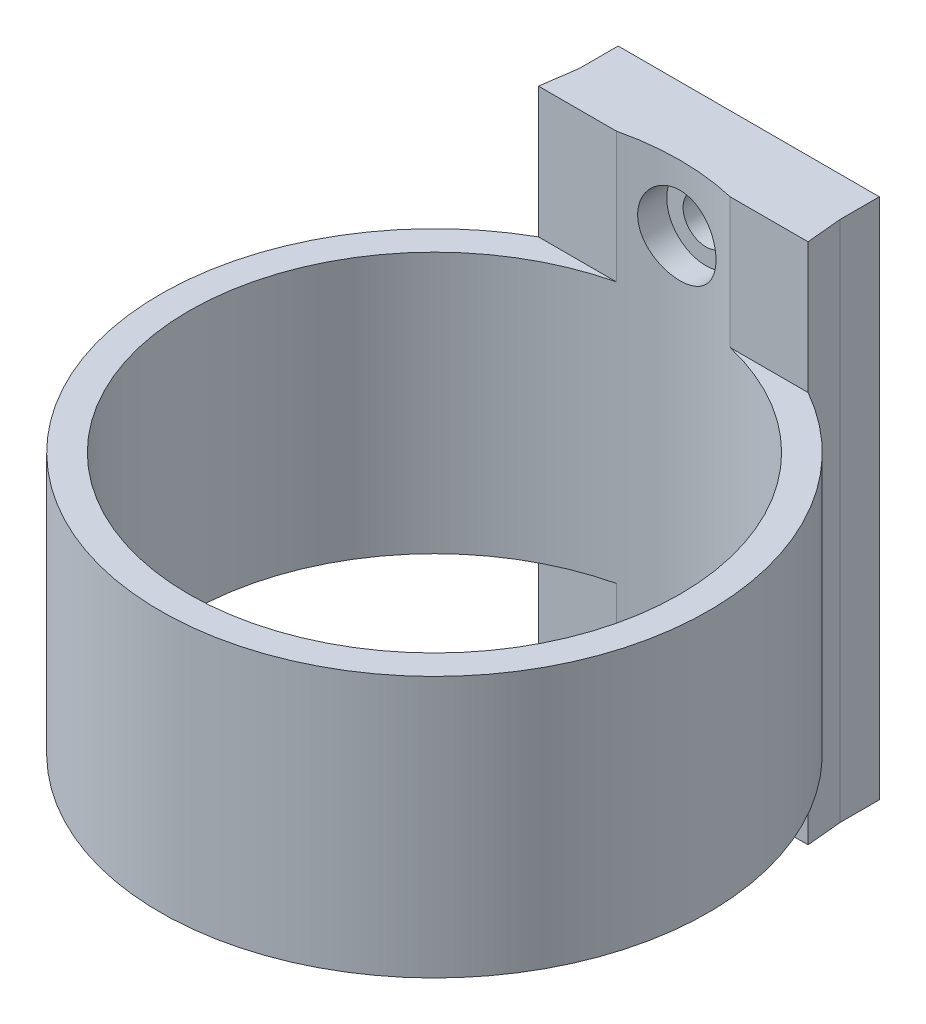
ISO-10303-21;
HEADER;
FILE_DESCRIPTION(('STEP AP214'),'2;1');
FILE_NAME('part.step','',(''),(''),'','','');
FILE_SCHEMA(('AUTOMOTIVE_DESIGN { 1 0 10303 214 1 1 1 1 }'));
ENDSEC;
DATA;
#1=APPLICATION_CONTEXT('core data for automotive mechanical design processes');
#2=APPLICATION_PROTOCOL_DEFINITION('international standard','automotive_design',2000,#1);
#3=PRODUCT_CONTEXT('',#1,'mechanical');
#4=PRODUCT('Part','Part','',(#3));
#5=PRODUCT_RELATED_PRODUCT_CATEGORY('part','',(#4));
#6=PRODUCT_DEFINITION_FORMATION('','',#4);
#7=PRODUCT_DEFINITION_CONTEXT('part definition',#1,'design');
#8=PRODUCT_DEFINITION('design','',#6,#7);
#9=PRODUCT_DEFINITION_SHAPE('','',#8);
#10=(LENGTH_UNIT() NAMED_UNIT(*) SI_UNIT(.MILLI.,.METRE.));
#11=(NAMED_UNIT(*) PLANE_ANGLE_UNIT() SI_UNIT($,.RADIAN.));
#12=(NAMED_UNIT(*) SI_UNIT($,.STERADIAN.) SOLID_ANGLE_UNIT());
#13=UNCERTAINTY_MEASURE_WITH_UNIT(LENGTH_MEASURE(1.E-05),#10,'distance_accuracy_value','');
#14=(GEOMETRIC_REPRESENTATION_CONTEXT(3) GLOBAL_UNCERTAINTY_ASSIGNED_CONTEXT((#13)) GLOBAL_UNIT_ASSIGNED_CONTEXT((#10,
#11,#12)) REPRESENTATION_CONTEXT('',''));
#15=CARTESIAN_POINT('',(0.,0.,0.));
#16=DIRECTION('',(0.,0.,1.));
#17=DIRECTION('',(1.,0.,0.));
#18=AXIS2_PLACEMENT_3D('',#15,#16,#17);
#19=CARTESIAN_POINT('',(0.,-30.8228188796824,-18.2877454768375));
#20=DIRECTION('',(0.,0.,1.));
#21=DIRECTION('',(1.,0.,0.));
#22=AXIS2_PLACEMENT_3D('',#19,#20,#21);
#23=PLANE('',#22);
#24=DIRECTION('',(0.,1.,0.));
#25=VECTOR('',#24,1.);
#26=CARTESIAN_POINT('',(4.35871143509305,-10.,-18.2877454768375));
#27=LINE('',#26,#25);
#28=CARTESIAN_POINT('',(4.35871143509305,-10.,-18.2877454768375));
#29=VERTEX_POINT('',#28);
#30=CARTESIAN_POINT('',(4.35871143509305,0.,-18.2877454768375));
#31=VERTEX_POINT('',#30);
#32=EDGE_CURVE('E141',#29,#31,#27,.T.);
#33=ORIENTED_EDGE('',*,*,#32,.F.);
#34=DIRECTION('',(-1.,0.,0.));
#35=VECTOR('',#34,1.);
#36=CARTESIAN_POINT('',(0.,-10.,-18.2877454768375));
#37=LINE('',#36,#35);
#38=CARTESIAN_POINT('',(10.3227111445788,-10.,-18.2877454768375));
#39=VERTEX_POINT('',#38);
#40=EDGE_CURVE('E147',#39,#29,#37,.T.);
#41=ORIENTED_EDGE('',*,*,#40,.F.);
#42=DIRECTION('',(0.,1.,0.));
#43=VECTOR('',#42,1.);
#44=CARTESIAN_POINT('',(10.3227111445788,-30.8228188796824,-18.2877454768375));
#45=LINE('',#44,#43);
#46=CARTESIAN_POINT('',(10.3227111445788,0.,-18.2877454768375));
#47=VERTEX_POINT('',#46);
#48=EDGE_CURVE('E73',#39,#47,#45,.T.);
#49=ORIENTED_EDGE('',*,*,#48,.T.);
#50=DIRECTION('',(1.,0.,0.));
#51=VECTOR('',#50,1.);
#52=CARTESIAN_POINT('',(0.,0.,-18.2877454768375));
#53=LINE('',#52,#51);
#54=EDGE_CURVE('E57',#31,#47,#53,.T.);
#55=ORIENTED_EDGE('',*,*,#54,.F.);
#56=EDGE_LOOP('',(#33,#41,#49,#55));
#57=FACE_BOUND('',#56,.T.);
#58=ADVANCED_FACE('F43',(#57),#23,.T.);
#59=CARTESIAN_POINT('',(4.35871143509305,20.,-18.2877454768375));
#60=VERTEX_POINT('',#59);
#61=CARTESIAN_POINT('',(4.35871143509305,30.,-18.2877454768375));
#62=VERTEX_POINT('',#61);
#63=EDGE_CURVE('E151',#60,#62,#27,.T.);
#64=ORIENTED_EDGE('',*,*,#63,.F.);
#65=DIRECTION('',(1.,0.,0.));
#66=VECTOR('',#65,1.);
#67=CARTESIAN_POINT('',(0.,20.,-18.2877454768375));
#68=LINE('',#67,#66);
#69=CARTESIAN_POINT('',(10.3227111445788,20.,-18.2877454768375));
#70=VERTEX_POINT('',#69);
#71=EDGE_CURVE('E156',#60,#70,#68,.T.);
#72=ORIENTED_EDGE('',*,*,#71,.T.);
#73=CARTESIAN_POINT('',(10.3227111445788,30.,-18.2877454768375));
#74=VERTEX_POINT('',#73);
#75=EDGE_CURVE('E236',#70,#74,#45,.T.);
#76=ORIENTED_EDGE('',*,*,#75,.T.);
#77=DIRECTION('',(1.,0.,0.));
#78=VECTOR('',#77,1.);
#79=CARTESIAN_POINT('',(0.,30.,-18.2877454768375));
#80=LINE('',#79,#78);
#81=EDGE_CURVE('E223',#62,#74,#80,.T.);
#82=ORIENTED_EDGE('',*,*,#81,.F.);
#83=EDGE_LOOP('',(#64,#72,#76,#82));
#84=FACE_BOUND('',#83,.T.);
#85=ADVANCED_FACE('F311',(#84),#23,.T.);
#86=DIRECTION('',(0.,1.,0.));
#87=VECTOR('',#86,1.);
#88=CARTESIAN_POINT('',(-4.35871143509305,-10.,-18.2877454768375));
#89=LINE('',#88,#87);
#90=CARTESIAN_POINT('',(-4.35871143509305,30.,-18.2877454768375));
#91=VERTEX_POINT('',#90);
#92=CARTESIAN_POINT('',(-4.35871143509305,20.,-18.2877454768375));
#93=VERTEX_POINT('',#92);
#94=EDGE_CURVE('E257',#91,#93,#89,.F.);
#95=ORIENTED_EDGE('',*,*,#94,.F.);
#96=CARTESIAN_POINT('',(-10.3227111445788,30.,-18.2877454768375));
#97=VERTEX_POINT('',#96);
#98=EDGE_CURVE('E224',#97,#91,#80,.T.);
#99=ORIENTED_EDGE('',*,*,#98,.F.);
#100=DIRECTION('',(0.,1.,0.));
#101=VECTOR('',#100,1.);
#102=CARTESIAN_POINT('',(-10.3227111445788,-30.8228188796824,-18.2877454768375));
#103=LINE('',#102,#101);
#104=CARTESIAN_POINT('',(-10.3227111445788,20.,-18.2877454768375));
#105=VERTEX_POINT('',#104);
#106=EDGE_CURVE('E230',#105,#97,#103,.T.);
#107=ORIENTED_EDGE('',*,*,#106,.F.);
#108=EDGE_CURVE('E159',#105,#93,#68,.T.);
#109=ORIENTED_EDGE('',*,*,#108,.T.);
#110=EDGE_LOOP('',(#95,#99,#107,#109));
#111=FACE_BOUND('',#110,.T.);
#112=ADVANCED_FACE('F256',(#111),#23,.T.);
#113=CARTESIAN_POINT('',(0.,25.,-24.));
#114=DIRECTION('',(0.,0.,1.));
#115=DIRECTION('',(1.,0.,0.));
#116=AXIS2_PLACEMENT_3D('',#113,#114,#115);
#117=CYLINDRICAL_SURFACE('',#116,1.75);
#118=CARTESIAN_POINT('',(0.,25.,-24.));
#119=DIRECTION('',(0.,0.,-1.));
#120=DIRECTION('',(-1.,0.,0.));
#121=AXIS2_PLACEMENT_3D('',#118,#119,#120);
#122=CIRCLE('',#121,1.75);
#123=CARTESIAN_POINT('',(-1.75,25.,-24.));
#124=VERTEX_POINT('',#123);
#125=EDGE_CURVE('E182',#124,#124,#122,.T.);
#126=ORIENTED_EDGE('',*,*,#125,.T.);
#127=EDGE_LOOP('',(#126));
#128=FACE_BOUND('',#127,.T.);
#129=CARTESIAN_POINT('',(0.,25.,-20.7877454768375));
#130=DIRECTION('',(0.,0.,1.));
#131=DIRECTION('',(1.,0.,0.));
#132=AXIS2_PLACEMENT_3D('',#129,#130,#131);
#133=CIRCLE('',#132,1.75);
#134=CARTESIAN_POINT('',(1.75,25.,-20.7877454768375));
#135=VERTEX_POINT('',#134);
#136=EDGE_CURVE('E179',#135,#135,#133,.T.);
#137=ORIENTED_EDGE('',*,*,#136,.T.);
#138=EDGE_LOOP('',(#137));
#139=FACE_BOUND('',#138,.T.);
#140=ADVANCED_FACE('F329',(#128,#139),#117,.F.);
#141=CARTESIAN_POINT('',(0.,20.,0.));
#142=DIRECTION('',(0.,-1.,0.));
#143=DIRECTION('',(0.,0.,-1.));
#144=AXIS2_PLACEMENT_3D('',#141,#142,#143);
#145=CYLINDRICAL_SURFACE('',#144,18.8);
#146=CARTESIAN_POINT('',(0.,20.,0.));
#147=DIRECTION('',(0.,1.,0.));
#148=DIRECTION('',(0.,0.,1.));
#149=AXIS2_PLACEMENT_3D('',#146,#147,#148);
#150=CIRCLE('',#149,18.8);
#151=EDGE_CURVE('E166',#93,#60,#150,.T.);
#152=ORIENTED_EDGE('',*,*,#151,.T.);
#153=ORIENTED_EDGE('',*,*,#63,.T.);
#154=CARTESIAN_POINT('',(0.,30.,0.));
#155=DIRECTION('',(0.,1.,0.));
#156=DIRECTION('',(0.,0.,1.));
#157=AXIS2_PLACEMENT_3D('',#154,#155,#156);
#158=CIRCLE('',#157,18.8);
#159=EDGE_CURVE('E145',#62,#91,#158,.T.);
#160=ORIENTED_EDGE('',*,*,#159,.T.);
#161=ORIENTED_EDGE('',*,*,#94,.T.);
#162=EDGE_LOOP('',(#152,#153,#160,#161));
#163=FACE_BOUND('',#162,.T.);
#164=CARTESIAN_POINT('',(0.,0.,0.));
#165=DIRECTION('',(0.,1.,0.));
#166=DIRECTION('',(0.,0.,1.));
#167=AXIS2_PLACEMENT_3D('',#164,#165,#166);
#168=CIRCLE('',#167,18.8);
#169=CARTESIAN_POINT('',(-4.35871143509305,0.,-18.2877454768375));
#170=VERTEX_POINT('',#169);
#171=EDGE_CURVE('E173',#170,#31,#168,.T.);
#172=ORIENTED_EDGE('',*,*,#171,.F.);
#173=CARTESIAN_POINT('',(-4.35871143509305,-10.,-18.2877454768375));
#174=VERTEX_POINT('',#173);
#175=EDGE_CURVE('E65',#170,#174,#89,.F.);
#176=ORIENTED_EDGE('',*,*,#175,.T.);
#177=CARTESIAN_POINT('',(0.,-10.,0.));
#178=DIRECTION('',(0.,1.,0.));
#179=DIRECTION('',(0.,0.,1.));
#180=AXIS2_PLACEMENT_3D('',#177,#178,#179);
#181=CIRCLE('',#180,18.8);
#182=EDGE_CURVE('E138',#29,#174,#181,.T.);
#183=ORIENTED_EDGE('',*,*,#182,.F.);
#184=ORIENTED_EDGE('',*,*,#32,.T.);
#185=EDGE_LOOP('',(#172,#176,#183,#184));
#186=FACE_BOUND('',#185,.T.);
#187=CARTESIAN_POINT('',(3.,25.,-18.5590948055125));
#188=CARTESIAN_POINT('',(2.99999318892495,25.1673562638819,-18.5590977359691));
#189=CARTESIAN_POINT('',(2.98594854504428,25.3348064448324,-18.5613830190373));
#190=CARTESIAN_POINT('',(2.93016129785979,25.6650157408036,-18.5702698430194));
#191=CARTESIAN_POINT('',(2.88839250631574,25.8277702684864,-18.5768754648406));
#192=CARTESIAN_POINT('',(2.77844643085269,26.143761240467,-18.5936361874363));
#193=CARTESIAN_POINT('',(2.71029042650948,26.2970052391405,-18.6037884274506));
#194=CARTESIAN_POINT('',(2.54955639572988,26.5898635499249,-18.626495098435));
#195=CARTESIAN_POINT('',(2.45698138562151,26.7294795425023,-18.6390492326616));
#196=CARTESIAN_POINT('',(2.24914353877349,26.9924003573968,-18.66527207743));
#197=CARTESIAN_POINT('',(2.13370314841839,27.1155640251879,-18.678948986173));
#198=CARTESIAN_POINT('',(1.88379506479912,27.3408592162709,-18.7058033618212));
#199=CARTESIAN_POINT('',(1.74932628083799,27.4429895331183,-18.718980800042));
#200=CARTESIAN_POINT('',(1.4642682708742,27.6238448694721,-18.7434378393928));
#201=CARTESIAN_POINT('',(1.31359507106882,27.7024391100943,-18.7547066903802));
#202=CARTESIAN_POINT('',(1.000975936815,27.8331512875055,-18.7739858136105));
#203=CARTESIAN_POINT('',(0.839030675642924,27.8852708040803,-18.7819962802804));
#204=CARTESIAN_POINT('',(0.509920895076498,27.9611239591642,-18.7937982134282));
#205=CARTESIAN_POINT('',(0.342812245321676,27.9850944403802,-18.7976248629377));
#206=CARTESIAN_POINT('',(0.0069039478393011,28.0047051042349,-18.8007487532914));
#207=CARTESIAN_POINT('',(-0.161895593451601,28.0003470590207,-18.800046277464));
#208=CARTESIAN_POINT('',(-0.494776240931091,27.9636100477826,-18.794219031933));
#209=CARTESIAN_POINT('',(-0.658886277273516,27.931485933555,-18.7891344844437));
#210=CARTESIAN_POINT('',(-0.979356317003154,27.8405294166019,-18.7751592159119));
#211=CARTESIAN_POINT('',(-1.13571609988515,27.7816962544511,-18.7662683866449));
#212=CARTESIAN_POINT('',(-1.43701095824883,27.6387350932121,-18.7456107465306));
#213=CARTESIAN_POINT('',(-1.58189487722374,27.5545010868994,-18.7338319222753));
#214=CARTESIAN_POINT('',(-1.85556761622716,27.3632068758382,-18.7087087449867));
#215=CARTESIAN_POINT('',(-1.98435523867987,27.2561449742799,-18.6953642756112));
#216=CARTESIAN_POINT('',(-2.22368381732544,27.0208178147316,-18.6684204596662));
#217=CARTESIAN_POINT('',(-2.33400583130253,26.8923299123418,-18.6548199291916));
#218=CARTESIAN_POINT('',(-2.53155842395281,26.6185509568964,-18.6290409827237));
#219=CARTESIAN_POINT('',(-2.61878882253564,26.4732597728056,-18.6168625778219));
#220=CARTESIAN_POINT('',(-2.76771915489245,26.1697558967886,-18.5953065590279));
#221=CARTESIAN_POINT('',(-2.82939441969468,26.0115308950872,-18.5859316538375));
#222=CARTESIAN_POINT('',(-2.92523200533723,25.6867843610342,-18.5710902230895));
#223=CARTESIAN_POINT('',(-2.95939653535264,25.5202634959999,-18.5656233837093));
#224=CARTESIAN_POINT('',(-2.99893806970813,25.1856062857924,-18.5592772714232));
#225=CARTESIAN_POINT('',(-3.00462641573285,25.017507636697,-18.5583483859428));
#226=CARTESIAN_POINT('',(-2.98788223593521,24.682759048833,-18.5610513954425));
#227=CARTESIAN_POINT('',(-2.96545070220465,24.5161090591635,-18.5646831295203));
#228=CARTESIAN_POINT('',(-2.89336835895268,24.1899666421187,-18.5760524510578));
#229=CARTESIAN_POINT('',(-2.84387455068403,24.0304386165593,-18.583766347708));
#230=CARTESIAN_POINT('',(-2.71923667635824,23.7219418702682,-18.6024111045148));
#231=CARTESIAN_POINT('',(-2.64409119184296,23.5729737340158,-18.6133421425645));
#232=CARTESIAN_POINT('',(-2.46954247701574,23.2884353888777,-18.6373055130477));
#233=CARTESIAN_POINT('',(-2.36993884330776,23.1529895770723,-18.6503548868594));
#234=CARTESIAN_POINT('',(-2.1495778133456,22.9006235702905,-18.6770341083684));
#235=CARTESIAN_POINT('',(-2.02881905761585,22.7837045668086,-18.690663993328));
#236=CARTESIAN_POINT('',(-1.76819989194077,22.5705824028101,-18.717124607379));
#237=CARTESIAN_POINT('',(-1.62816912488751,22.4745863080164,-18.7299465276182));
#238=CARTESIAN_POINT('',(-1.33378767586834,22.3074819263669,-18.7532071806968));
#239=CARTESIAN_POINT('',(-1.17943742680675,22.2363728874396,-18.7636459855493));
#240=CARTESIAN_POINT('',(-0.861427282408366,22.1213871552065,-18.7809258171124));
#241=CARTESIAN_POINT('',(-0.697808159511767,22.0773999838052,-18.7877814219813));
#242=CARTESIAN_POINT('',(-0.365387507090756,22.0175500608406,-18.7971838564269));
#243=CARTESIAN_POINT('',(-0.196586367979265,22.001685195808,-18.7997310097951));
#244=CARTESIAN_POINT('',(0.139403880011763,21.9985870089501,-18.8002255532696));
#245=CARTESIAN_POINT('',(0.306590086889828,22.0110378641716,-18.7982236816976));
#246=CARTESIAN_POINT('',(0.636458250003312,22.0635372705304,-18.7899481258721));
#247=CARTESIAN_POINT('',(0.799140226499904,22.1035856975057,-18.7836744608374));
#248=CARTESIAN_POINT('',(1.11527615273787,22.2100261741958,-18.7675573419504));
#249=CARTESIAN_POINT('',(1.26873859430096,22.2763935403306,-18.757717233678));
#250=CARTESIAN_POINT('',(1.5623989172001,22.4335534928945,-18.7355442996084));
#251=CARTESIAN_POINT('',(1.70259625505322,22.5243470795019,-18.7232113717431));
#252=CARTESIAN_POINT('',(1.96734253732511,22.7289116864949,-18.6972583179133));
#253=CARTESIAN_POINT('',(2.09171093296998,22.8429148478705,-18.6836259927591));
#254=CARTESIAN_POINT('',(2.3196649561653,23.0901744369638,-18.6566975567571));
#255=CARTESIAN_POINT('',(2.42324570719552,23.2234353697308,-18.6434015254375));
#256=CARTESIAN_POINT('',(2.60729002685677,23.5064405515707,-18.6185591171466));
#257=CARTESIAN_POINT('',(2.68760079212166,23.6562852046091,-18.6070245305409));
#258=CARTESIAN_POINT('',(2.82179083517674,23.967456394632,-18.5871497956829));
#259=CARTESIAN_POINT('',(2.87569696852755,24.1287710736206,-18.5788064036393));
#260=CARTESIAN_POINT('',(2.94360864550681,24.408964309082,-18.5681430856028));
#261=CARTESIAN_POINT('',(2.96472217082333,24.5261308643433,-18.5647684601497));
#262=CARTESIAN_POINT('',(2.99292015772034,24.7621824875018,-18.5602432963531));
#263=CARTESIAN_POINT('',(3.00000484032071,24.881067528295,-18.5590927229704));
#264=CARTESIAN_POINT('',(3.,25.,-18.5590948055125));
#265=B_SPLINE_CURVE_WITH_KNOTS('',3,(#187,#188,#189,#190,#191,#192,#193,#194,#195,#196,#197,
#198,#199,#200,#201,#202,#203,#204,#205,#206,#207,#208,#209,#210,#211,#212,#213,#214,#215,#216,
#217,#218,#219,#220,#221,#222,#223,#224,#225,#226,#227,#228,#229,#230,#231,#232,#233,#234,#235,
#236,#237,#238,#239,#240,#241,#242,#243,#244,#245,#246,#247,#248,#249,#250,#251,#252,#253,#254,
#255,#256,#257,#258,#259,#260,#261,#262,#263,#264),.UNSPECIFIED.,.T.,.F.,(4,2,2,2,2,2,2,2,2,2,2,
2,2,2,2,2,2,2,2,2,2,2,2,2,2,2,2,2,2,2,2,2,2,2,2,2,2,2,4),(0.,0.501633967677758,1.00374245461071,
1.50544686421736,2.00708933039391,2.51279169291906,3.01852305377313,3.52701449701676,
4.03547559426058,4.53962718961569,5.04374724707395,5.54328877260908,6.04284450262919,
6.54451461774552,7.04622203528077,7.55351115156399,8.06080422405306,8.56858586397689,
9.07632672380335,9.57850393351623,10.0806634265151,10.5799400937304,11.0792443738705,
11.5827849583833,12.0863579134212,12.5947085162692,13.1030437557474,13.6092944235725,
14.1155070436438,14.6161012847971,15.1166932737845,15.6168168818048,16.1169609714627,
16.6223776541084,17.1279127629223,17.6366959263551,18.1449605377383,18.5014545597637,
18.857942965296),.UNSPECIFIED.);
#266=CARTESIAN_POINT('',(3.,25.,-18.5590948055125));
#267=VERTEX_POINT('',#266);
#268=EDGE_CURVE('E47',#267,#267,#265,.T.);
#269=ORIENTED_EDGE('',*,*,#268,.F.);
#270=EDGE_LOOP('',(#269));
#271=FACE_BOUND('',#270,.T.);
#272=CARTESIAN_POINT('',(3.,-5.00000000000003,-18.5590948055125));
#273=CARTESIAN_POINT('',(2.99999318892495,-4.83264373611809,-18.5590977359691));
#274=CARTESIAN_POINT('',(2.98594854504428,-4.66519355516765,-18.5613830190373));
#275=CARTESIAN_POINT('',(2.93016129785979,-4.33498425919646,-18.5702698430194));
#276=CARTESIAN_POINT('',(2.88839250631574,-4.1722297315136,-18.5768754648406));
#277=CARTESIAN_POINT('',(2.77844643085269,-3.85623875953308,-18.5936361874363));
#278=CARTESIAN_POINT('',(2.71029042650948,-3.70299476085954,-18.6037884274506));
#279=CARTESIAN_POINT('',(2.54955639572988,-3.41013645007518,-18.626495098435));
#280=CARTESIAN_POINT('',(2.45698138562151,-3.27052045749769,-18.6390492326616));
#281=CARTESIAN_POINT('',(2.24914353877349,-3.00759964260323,-18.66527207743));
#282=CARTESIAN_POINT('',(2.13370314841838,-2.88443597481214,-18.678948986173));
#283=CARTESIAN_POINT('',(1.88379506479911,-2.65914078372914,-18.7058033618212));
#284=CARTESIAN_POINT('',(1.74932628083799,-2.55701046688175,-18.718980800042));
#285=CARTESIAN_POINT('',(1.4642682708742,-2.37615513052795,-18.7434378393928));
#286=CARTESIAN_POINT('',(1.31359507106882,-2.29756088990574,-18.7547066903802));
#287=CARTESIAN_POINT('',(1.000975936815,-2.16684871249452,-18.7739858136105));
#288=CARTESIAN_POINT('',(0.839030675642925,-2.1147291959197,-18.7819962802804));
#289=CARTESIAN_POINT('',(0.509920895076498,-2.03887604083581,-18.7937982134282));
#290=CARTESIAN_POINT('',(0.342812245321676,-2.01490555961982,-18.7976248629377));
#291=CARTESIAN_POINT('',(0.00690394783930035,-1.9952948957651,-18.8007487532914));
#292=CARTESIAN_POINT('',(-0.161895593451602,-1.99965294097935,-18.800046277464));
#293=CARTESIAN_POINT('',(-0.494776240931092,-2.03638995221743,-18.794219031933));
#294=CARTESIAN_POINT('',(-0.658886277273516,-2.06851406644503,-18.7891344844437));
#295=CARTESIAN_POINT('',(-0.979356317003153,-2.15947058339809,-18.7751592159119));
#296=CARTESIAN_POINT('',(-1.13571609988515,-2.21830374554893,-18.7662683866449));
#297=CARTESIAN_POINT('',(-1.43701095824883,-2.3612649067879,-18.7456107465306));
#298=CARTESIAN_POINT('',(-1.58189487722374,-2.44549891310062,-18.7338319222753));
#299=CARTESIAN_POINT('',(-1.85556761622716,-2.63679312416182,-18.7087087449867));
#300=CARTESIAN_POINT('',(-1.98435523867987,-2.74385502572012,-18.6953642756112));
#301=CARTESIAN_POINT('',(-2.22368381732544,-2.9791821852684,-18.6684204596662));
#302=CARTESIAN_POINT('',(-2.33400583130253,-3.10767008765822,-18.6548199291916));
#303=CARTESIAN_POINT('',(-2.53155842395281,-3.38144904310359,-18.6290409827237));
#304=CARTESIAN_POINT('',(-2.61878882253564,-3.52674022719439,-18.6168625778219));
#305=CARTESIAN_POINT('',(-2.76771915489245,-3.83024410321146,-18.5953065590279));
#306=CARTESIAN_POINT('',(-2.82939441969468,-3.98846910491283,-18.5859316538375));
#307=CARTESIAN_POINT('',(-2.92523200533723,-4.31321563896586,-18.5710902230895));
#308=CARTESIAN_POINT('',(-2.95939653535264,-4.47973650400012,-18.5656233837093));
#309=CARTESIAN_POINT('',(-2.99893806970813,-4.81439371420766,-18.5592772714232));
#310=CARTESIAN_POINT('',(-3.00462641573285,-4.98249236330307,-18.5583483859428));
#311=CARTESIAN_POINT('',(-2.98788223593521,-5.31724095116703,-18.5610513954425));
#312=CARTESIAN_POINT('',(-2.96545070220465,-5.48389094083658,-18.5646831295203));
#313=CARTESIAN_POINT('',(-2.89336835895268,-5.81003335788135,-18.5760524510578));
#314=CARTESIAN_POINT('',(-2.84387455068403,-5.9695613834407,-18.583766347708));
#315=CARTESIAN_POINT('',(-2.71923667635824,-6.27805812973181,-18.6024111045148));
#316=CARTESIAN_POINT('',(-2.64409119184296,-6.42702626598419,-18.6133421425645));
#317=CARTESIAN_POINT('',(-2.46954247701574,-6.71156461112234,-18.6373055130477));
#318=CARTESIAN_POINT('',(-2.36993884330776,-6.84701042292773,-18.6503548868594));
#319=CARTESIAN_POINT('',(-2.1495778133456,-7.0993764297095,-18.6770341083684));
#320=CARTESIAN_POINT('',(-2.02881905761584,-7.21629543319146,-18.690663993328));
#321=CARTESIAN_POINT('',(-1.76819989194077,-7.42941759718995,-18.717124607379));
#322=CARTESIAN_POINT('',(-1.62816912488751,-7.52541369198363,-18.7299465276182));
#323=CARTESIAN_POINT('',(-1.33378767586834,-7.69251807363312,-18.7532071806968));
#324=CARTESIAN_POINT('',(-1.17943742680675,-7.76362711256048,-18.7636459855493));
#325=CARTESIAN_POINT('',(-0.861427282408365,-7.87861284479356,-18.7809258171124));
#326=CARTESIAN_POINT('',(-0.697808159511767,-7.92260001619486,-18.7877814219813));
#327=CARTESIAN_POINT('',(-0.365387507090754,-7.98244993915946,-18.7971838564269));
#328=CARTESIAN_POINT('',(-0.196586367979263,-7.998314804192,-18.7997310097951));
#329=CARTESIAN_POINT('',(0.139403880011766,-8.00141299104995,-18.8002255532696));
#330=CARTESIAN_POINT('',(0.30659008688983,-7.9889621358284,-18.7982236816976));
#331=CARTESIAN_POINT('',(0.636458250003314,-7.93646272946966,-18.7899481258721));
#332=CARTESIAN_POINT('',(0.799140226499906,-7.89641430249434,-18.7836744608374));
#333=CARTESIAN_POINT('',(1.11527615273787,-7.7899738258042,-18.7675573419504));
#334=CARTESIAN_POINT('',(1.26873859430097,-7.72360645966939,-18.757717233678));
#335=CARTESIAN_POINT('',(1.5623989172001,-7.56644650710557,-18.7355442996084));
#336=CARTESIAN_POINT('',(1.70259625505323,-7.47565292049814,-18.7232113717431));
#337=CARTESIAN_POINT('',(1.96734253732511,-7.27108831350516,-18.6972583179133));
#338=CARTESIAN_POINT('',(2.09171093296998,-7.15708515212954,-18.6836259927591));
#339=CARTESIAN_POINT('',(2.3196649561653,-6.90982556303623,-18.6566975567571));
#340=CARTESIAN_POINT('',(2.42324570719552,-6.7765646302692,-18.6434015254375));
#341=CARTESIAN_POINT('',(2.60729002685678,-6.49355944842934,-18.6185591171466));
#342=CARTESIAN_POINT('',(2.68760079212166,-6.34371479539088,-18.6070245305409));
#343=CARTESIAN_POINT('',(2.82179083517674,-6.03254360536804,-18.5871497956829));
#344=CARTESIAN_POINT('',(2.87569696852755,-5.87122892637947,-18.5788064036393));
#345=CARTESIAN_POINT('',(2.94360864550681,-5.59103569091798,-18.5681430856028));
#346=CARTESIAN_POINT('',(2.96472217082333,-5.47386913565669,-18.5647684601497));
#347=CARTESIAN_POINT('',(2.99292015772034,-5.23781751249827,-18.5602432963531));
#348=CARTESIAN_POINT('',(3.00000484032071,-5.11893247170506,-18.5590927229704));
#349=CARTESIAN_POINT('',(3.,-5.00000000000003,-18.5590948055125));
#350=B_SPLINE_CURVE_WITH_KNOTS('',3,(#272,#273,#274,#275,#276,#277,#278,#279,#280,#281,#282,
#283,#284,#285,#286,#287,#288,#289,#290,#291,#292,#293,#294,#295,#296,#297,#298,#299,#300,#301,
#302,#303,#304,#305,#306,#307,#308,#309,#310,#311,#312,#313,#314,#315,#316,#317,#318,#319,#320,
#321,#322,#323,#324,#325,#326,#327,#328,#329,#330,#331,#332,#333,#334,#335,#336,#337,#338,#339,
#340,#341,#342,#343,#344,#345,#346,#347,#348,#349),.UNSPECIFIED.,.T.,.F.,(4,2,2,2,2,2,2,2,2,2,2,
2,2,2,2,2,2,2,2,2,2,2,2,2,2,2,2,2,2,2,2,2,2,2,2,2,2,2,4),(0.,0.501633967677761,1.00374245461071,
1.50544686421736,2.00708933039391,2.51279169291907,3.01852305377313,3.52701449701676,
4.03547559426057,4.53962718961569,5.04374724707395,5.54328877260908,6.04284450262919,
6.54451461774552,7.04622203528076,7.55351115156399,8.06080422405306,8.56858586397689,
9.07632672380335,9.57850393351622,10.0806634265151,10.5799400937304,11.0792443738705,
11.5827849583833,12.0863579134211,12.5947085162692,13.1030437557474,13.6092944235725,
14.1155070436438,14.6161012847971,15.1166932737844,15.6168168818048,16.1169609714627,
16.6223776541084,17.1279127629223,17.6366959263551,18.1449605377383,18.5014545597637,
18.857942965296),.UNSPECIFIED.);
#351=CARTESIAN_POINT('',(3.,-5.00000000000003,-18.5590948055125));
#352=VERTEX_POINT('',#351);
#353=EDGE_CURVE('E280',#352,#352,#350,.T.);
#354=ORIENTED_EDGE('',*,*,#353,.F.);
#355=EDGE_LOOP('',(#354));
#356=FACE_BOUND('',#355,.T.);
#357=ADVANCED_FACE('F45',(#163,#186,#271,#356),#145,.F.);
#358=CARTESIAN_POINT('',(0.,20.,0.));
#359=DIRECTION('',(0.,-1.,0.));
#360=DIRECTION('',(0.,0.,-1.));
#361=AXIS2_PLACEMENT_3D('',#358,#359,#360);
#362=CYLINDRICAL_SURFACE('',#361,21.);
#363=CARTESIAN_POINT('',(0.,20.,0.));
#364=DIRECTION('',(0.,1.,0.));
#365=DIRECTION('',(0.,0.,1.));
#366=AXIS2_PLACEMENT_3D('',#363,#364,#365);
#367=CIRCLE('',#366,21.);
#368=EDGE_CURVE('E169',#105,#70,#367,.T.);
#369=ORIENTED_EDGE('',*,*,#368,.F.);
#370=CARTESIAN_POINT('',(-10.3227111445788,0.,-18.2877454768375));
#371=VERTEX_POINT('',#370);
#372=EDGE_CURVE('E243',#371,#105,#103,.T.);
#373=ORIENTED_EDGE('',*,*,#372,.F.);
#374=CARTESIAN_POINT('',(0.,0.,0.));
#375=DIRECTION('',(0.,1.,0.));
#376=DIRECTION('',(0.,0.,1.));
#377=AXIS2_PLACEMENT_3D('',#374,#375,#376);
#378=CIRCLE('',#377,21.);
#379=EDGE_CURVE('E170',#371,#47,#378,.T.);
#380=ORIENTED_EDGE('',*,*,#379,.T.);
#381=EDGE_CURVE('E235',#47,#70,#45,.T.);
#382=ORIENTED_EDGE('',*,*,#381,.T.);
#383=EDGE_LOOP('',(#369,#373,#380,#382));
#384=FACE_BOUND('',#383,.T.);
#385=ADVANCED_FACE('F273',(#384),#362,.T.);
#386=CARTESIAN_POINT('',(0.,20.,0.));
#387=DIRECTION('',(0.,1.,0.));
#388=DIRECTION('',(0.,0.,1.));
#389=AXIS2_PLACEMENT_3D('',#386,#387,#388);
#390=PLANE('',#389);
#391=ORIENTED_EDGE('',*,*,#108,.F.);
#392=ORIENTED_EDGE('',*,*,#368,.T.);
#393=ORIENTED_EDGE('',*,*,#71,.F.);
#394=ORIENTED_EDGE('',*,*,#151,.F.);
#395=EDGE_LOOP('',(#391,#392,#393,#394));
#396=FACE_BOUND('',#395,.T.);
#397=ADVANCED_FACE('F276',(#396),#390,.T.);
#398=CARTESIAN_POINT('',(0.,0.,0.));
#399=DIRECTION('',(0.,1.,0.));
#400=DIRECTION('',(0.,0.,1.));
#401=AXIS2_PLACEMENT_3D('',#398,#399,#400);
#402=PLANE('',#401);
#403=ORIENTED_EDGE('',*,*,#379,.F.);
#404=EDGE_CURVE('E11',#371,#170,#53,.T.);
#405=ORIENTED_EDGE('',*,*,#404,.T.);
#406=ORIENTED_EDGE('',*,*,#171,.T.);
#407=ORIENTED_EDGE('',*,*,#54,.T.);
#408=EDGE_LOOP('',(#403,#405,#406,#407));
#409=FACE_BOUND('',#408,.T.);
#410=ADVANCED_FACE('F270',(#409),#402,.F.);
#411=CARTESIAN_POINT('',(-12.6968769765504,-30.8228188796824,-1.83183354501147));
#412=DIRECTION('',(-0.989752164935604,0.,-0.142795840294055));
#413=DIRECTION('',(-0.142795840294055,0.,0.989752164935604));
#414=AXIS2_PLACEMENT_3D('',#411,#412,#413);
#415=PLANE('',#414);
#416=DIRECTION('',(0.142795840294055,0.,-0.989752164935604));
#417=VECTOR('',#416,1.);
#418=CARTESIAN_POINT('',(-12.6968769765504,-10.,-1.83183354501147));
#419=LINE('',#418,#417);
#420=CARTESIAN_POINT('',(-10.3227111445788,-10.,-18.2877454768375));
#421=VERTEX_POINT('',#420);
#422=CARTESIAN_POINT('',(-9.93140241351726,-10.,-21.));
#423=VERTEX_POINT('',#422);
#424=EDGE_CURVE('E161',#421,#423,#419,.T.);
#425=ORIENTED_EDGE('',*,*,#424,.F.);
#426=EDGE_CURVE('E163',#421,#371,#103,.T.);
#427=ORIENTED_EDGE('',*,*,#426,.T.);
#428=ORIENTED_EDGE('',*,*,#372,.T.);
#429=ORIENTED_EDGE('',*,*,#106,.T.);
#430=DIRECTION('',(-0.142795840294055,0.,0.989752164935604));
#431=VECTOR('',#430,1.);
#432=CARTESIAN_POINT('',(-12.6968769765504,30.,-1.83183354501147));
#433=LINE('',#432,#431);
#434=CARTESIAN_POINT('',(-9.93140241351726,30.,-21.));
#435=VERTEX_POINT('',#434);
#436=EDGE_CURVE('E217',#435,#97,#433,.T.);
#437=ORIENTED_EDGE('',*,*,#436,.F.);
#438=DIRECTION('',(0.,1.,0.));
#439=VECTOR('',#438,1.);
#440=CARTESIAN_POINT('',(-9.93140241351726,-30.8228188796824,-21.));
#441=LINE('',#440,#439);
#442=EDGE_CURVE('E219',#423,#435,#441,.T.);
#443=ORIENTED_EDGE('',*,*,#442,.F.);
#444=EDGE_LOOP('',(#425,#427,#428,#429,#437,#443));
#445=FACE_BOUND('',#444,.T.);
#446=ADVANCED_FACE('F250',(#445),#415,.T.);
#447=CARTESIAN_POINT('',(11.9313730125132,-30.8228188796824,-1.11786103527095));
#448=DIRECTION('',(-0.995639693068622,0.,0.0932823755391164));
#449=DIRECTION('',(0.0932823755391164,0.,0.995639693068622));
#450=AXIS2_PLACEMENT_3D('',#447,#448,#449);
#451=PLANE('',#450);
#452=ORIENTED_EDGE('',*,*,#48,.F.);
#453=DIRECTION('',(-0.0932823755391164,0.,-0.995639693068622));
#454=VECTOR('',#453,1.);
#455=CARTESIAN_POINT('',(11.9313730125132,-10.,-1.11786103527095));
#456=LINE('',#455,#454);
#457=CARTESIAN_POINT('',(10.0685975864827,-10.,-21.));
#458=VERTEX_POINT('',#457);
#459=EDGE_CURVE('E155',#39,#458,#456,.T.);
#460=ORIENTED_EDGE('',*,*,#459,.T.);
#461=DIRECTION('',(0.,1.,0.));
#462=VECTOR('',#461,1.);
#463=CARTESIAN_POINT('',(10.0685975864827,-30.8228188796824,-21.));
#464=LINE('',#463,#462);
#465=CARTESIAN_POINT('',(10.0685975864827,30.,-21.));
#466=VERTEX_POINT('',#465);
#467=EDGE_CURVE('E233',#458,#466,#464,.T.);
#468=ORIENTED_EDGE('',*,*,#467,.T.);
#469=DIRECTION('',(0.0932823755391164,0.,0.995639693068622));
#470=VECTOR('',#469,1.);
#471=CARTESIAN_POINT('',(11.9313730125132,30.,-1.11786103527095));
#472=LINE('',#471,#470);
#473=EDGE_CURVE('E227',#466,#74,#472,.T.);
#474=ORIENTED_EDGE('',*,*,#473,.T.);
#475=ORIENTED_EDGE('',*,*,#75,.F.);
#476=ORIENTED_EDGE('',*,*,#381,.F.);
#477=EDGE_LOOP('',(#452,#460,#468,#474,#475,#476));
#478=FACE_BOUND('',#477,.T.);
#479=ADVANCED_FACE('F320',(#478),#451,.F.);
#480=ORIENTED_EDGE('',*,*,#175,.F.);
#481=ORIENTED_EDGE('',*,*,#404,.F.);
#482=ORIENTED_EDGE('',*,*,#426,.F.);
#483=EDGE_CURVE('E157',#174,#421,#37,.T.);
#484=ORIENTED_EDGE('',*,*,#483,.F.);
#485=EDGE_LOOP('',(#480,#481,#482,#484));
#486=FACE_BOUND('',#485,.T.);
#487=ADVANCED_FACE('F267',(#486),#23,.T.);
#488=CARTESIAN_POINT('',(0.,30.,0.));
#489=DIRECTION('',(0.,1.,0.));
#490=DIRECTION('',(0.,0.,1.));
#491=AXIS2_PLACEMENT_3D('',#488,#489,#490);
#492=PLANE('',#491);
#493=ORIENTED_EDGE('',*,*,#159,.F.);
#494=ORIENTED_EDGE('',*,*,#81,.T.);
#495=ORIENTED_EDGE('',*,*,#473,.F.);
#496=DIRECTION('',(0.,0.,1.));
#497=VECTOR('',#496,1.);
#498=CARTESIAN_POINT('',(10.0685975864827,30.,-24.));
#499=LINE('',#498,#497);
#500=CARTESIAN_POINT('',(10.0685975864827,30.,-24.));
#501=VERTEX_POINT('',#500);
#502=EDGE_CURVE('E208',#501,#466,#499,.T.);
#503=ORIENTED_EDGE('',*,*,#502,.F.);
#504=DIRECTION('',(-1.,0.,0.));
#505=VECTOR('',#504,1.);
#506=CARTESIAN_POINT('',(0.,30.,-24.));
#507=LINE('',#506,#505);
#508=CARTESIAN_POINT('',(-9.93140241351726,30.,-24.));
#509=VERTEX_POINT('',#508);
#510=EDGE_CURVE('E197',#501,#509,#507,.T.);
#511=ORIENTED_EDGE('',*,*,#510,.T.);
#512=DIRECTION('',(0.,0.,1.));
#513=VECTOR('',#512,1.);
#514=CARTESIAN_POINT('',(-9.93140241351726,30.,-24.));
#515=LINE('',#514,#513);
#516=EDGE_CURVE('E211',#509,#435,#515,.T.);
#517=ORIENTED_EDGE('',*,*,#516,.T.);
#518=ORIENTED_EDGE('',*,*,#436,.T.);
#519=ORIENTED_EDGE('',*,*,#98,.T.);
#520=EDGE_LOOP('',(#493,#494,#495,#503,#511,#517,#518,#519));
#521=FACE_BOUND('',#520,.T.);
#522=ADVANCED_FACE('F260',(#521),#492,.T.);
#523=CARTESIAN_POINT('',(0.,-10.,-24.));
#524=DIRECTION('',(0.,1.,0.));
#525=DIRECTION('',(0.,0.,1.));
#526=AXIS2_PLACEMENT_3D('',#523,#524,#525);
#527=PLANE('',#526);
#528=ORIENTED_EDGE('',*,*,#40,.T.);
#529=ORIENTED_EDGE('',*,*,#182,.T.);
#530=ORIENTED_EDGE('',*,*,#483,.T.);
#531=ORIENTED_EDGE('',*,*,#424,.T.);
#532=DIRECTION('',(0.,0.,1.));
#533=VECTOR('',#532,1.);
#534=CARTESIAN_POINT('',(-9.93140241351726,-10.,-24.));
#535=LINE('',#534,#533);
#536=CARTESIAN_POINT('',(-9.93140241351726,-10.,-24.));
#537=VERTEX_POINT('',#536);
#538=EDGE_CURVE('E214',#537,#423,#535,.T.);
#539=ORIENTED_EDGE('',*,*,#538,.F.);
#540=DIRECTION('',(-1.,0.,0.));
#541=VECTOR('',#540,1.);
#542=CARTESIAN_POINT('',(0.,-10.,-24.));
#543=LINE('',#542,#541);
#544=CARTESIAN_POINT('',(10.0685975864827,-10.,-24.));
#545=VERTEX_POINT('',#544);
#546=EDGE_CURVE('E186',#545,#537,#543,.T.);
#547=ORIENTED_EDGE('',*,*,#546,.F.);
#548=DIRECTION('',(0.,0.,1.));
#549=VECTOR('',#548,1.);
#550=CARTESIAN_POINT('',(10.0685975864827,-10.,-24.));
#551=LINE('',#550,#549);
#552=EDGE_CURVE('E206',#545,#458,#551,.T.);
#553=ORIENTED_EDGE('',*,*,#552,.T.);
#554=ORIENTED_EDGE('',*,*,#459,.F.);
#555=EDGE_LOOP('',(#528,#529,#530,#531,#539,#547,#553,#554));
#556=FACE_BOUND('',#555,.T.);
#557=ADVANCED_FACE('F153',(#556),#527,.F.);
#558=CARTESIAN_POINT('',(-9.93140241351726,0.,-24.));
#559=DIRECTION('',(1.,0.,0.));
#560=DIRECTION('',(0.,0.,-1.));
#561=AXIS2_PLACEMENT_3D('',#558,#559,#560);
#562=PLANE('',#561);
#563=ORIENTED_EDGE('',*,*,#442,.T.);
#564=ORIENTED_EDGE('',*,*,#516,.F.);
#565=DIRECTION('',(0.,1.,0.));
#566=VECTOR('',#565,1.);
#567=CARTESIAN_POINT('',(-9.93140241351726,0.,-24.));
#568=LINE('',#567,#566);
#569=EDGE_CURVE('E191',#537,#509,#568,.T.);
#570=ORIENTED_EDGE('',*,*,#569,.F.);
#571=ORIENTED_EDGE('',*,*,#538,.T.);
#572=EDGE_LOOP('',(#563,#564,#570,#571));
#573=FACE_BOUND('',#572,.T.);
#574=ADVANCED_FACE('F264',(#573),#562,.F.);
#575=CARTESIAN_POINT('',(10.0685975864827,0.,-24.));
#576=DIRECTION('',(1.,0.,0.));
#577=DIRECTION('',(0.,0.,-1.));
#578=AXIS2_PLACEMENT_3D('',#575,#576,#577);
#579=PLANE('',#578);
#580=ORIENTED_EDGE('',*,*,#467,.F.);
#581=ORIENTED_EDGE('',*,*,#552,.F.);
#582=DIRECTION('',(0.,1.,0.));
#583=VECTOR('',#582,1.);
#584=CARTESIAN_POINT('',(10.0685975864827,0.,-24.));
#585=LINE('',#584,#583);
#586=EDGE_CURVE('E200',#545,#501,#585,.T.);
#587=ORIENTED_EDGE('',*,*,#586,.T.);
#588=ORIENTED_EDGE('',*,*,#502,.T.);
#589=EDGE_LOOP('',(#580,#581,#587,#588));
#590=FACE_BOUND('',#589,.T.);
#591=ADVANCED_FACE('F345',(#590),#579,.T.);
#592=CARTESIAN_POINT('',(0.,-5.,-24.));
#593=DIRECTION('',(0.,0.,1.));
#594=DIRECTION('',(1.,0.,0.));
#595=AXIS2_PLACEMENT_3D('',#592,#593,#594);
#596=CYLINDRICAL_SURFACE('',#595,1.75);
#597=CARTESIAN_POINT('',(0.,-5.,-20.7877454768375));
#598=DIRECTION('',(0.,0.,-1.));
#599=DIRECTION('',(-1.,0.,0.));
#600=AXIS2_PLACEMENT_3D('',#597,#598,#599);
#601=CIRCLE('',#600,1.75);
#602=CARTESIAN_POINT('',(-1.75,-5.,-20.7877454768375));
#603=VERTEX_POINT('',#602);
#604=EDGE_CURVE('E177',#603,#603,#601,.F.);
#605=ORIENTED_EDGE('',*,*,#604,.T.);
#606=EDGE_LOOP('',(#605));
#607=FACE_BOUND('',#606,.T.);
#608=CARTESIAN_POINT('',(0.,-5.,-24.));
#609=DIRECTION('',(0.,0.,-1.));
#610=DIRECTION('',(-1.,0.,0.));
#611=AXIS2_PLACEMENT_3D('',#608,#609,#610);
#612=CIRCLE('',#611,1.75);
#613=CARTESIAN_POINT('',(-1.75,-5.,-24.));
#614=VERTEX_POINT('',#613);
#615=EDGE_CURVE('E203',#614,#614,#612,.F.);
#616=ORIENTED_EDGE('',*,*,#615,.F.);
#617=EDGE_LOOP('',(#616));
#618=FACE_BOUND('',#617,.T.);
#619=ADVANCED_FACE('F349',(#607,#618),#596,.F.);
#620=CARTESIAN_POINT('',(0.,0.,-24.));
#621=DIRECTION('',(0.,0.,-1.));
#622=DIRECTION('',(-1.,0.,0.));
#623=AXIS2_PLACEMENT_3D('',#620,#621,#622);
#624=PLANE('',#623);
#625=ORIENTED_EDGE('',*,*,#125,.F.);
#626=EDGE_LOOP('',(#625));
#627=FACE_BOUND('',#626,.T.);
#628=ORIENTED_EDGE('',*,*,#546,.T.);
#629=ORIENTED_EDGE('',*,*,#569,.T.);
#630=ORIENTED_EDGE('',*,*,#510,.F.);
#631=ORIENTED_EDGE('',*,*,#586,.F.);
#632=EDGE_LOOP('',(#628,#629,#630,#631));
#633=FACE_BOUND('',#632,.T.);
#634=ORIENTED_EDGE('',*,*,#615,.T.);
#635=EDGE_LOOP('',(#634));
#636=FACE_BOUND('',#635,.T.);
#637=ADVANCED_FACE('F306',(#627,#633,#636),#624,.T.);
#638=CARTESIAN_POINT('',(0.,-5.00000000000003,-20.7877454768375));
#639=DIRECTION('',(0.,0.,-1.));
#640=DIRECTION('',(-1.,0.,0.));
#641=AXIS2_PLACEMENT_3D('',#638,#639,#640);
#642=PLANE('',#641);
#643=CARTESIAN_POINT('',(0.,-5.00000000000003,-20.7877454768375));
#644=DIRECTION('',(0.,0.,1.));
#645=DIRECTION('',(-1.,0.,0.));
#646=AXIS2_PLACEMENT_3D('',#643,#644,#645);
#647=CIRCLE('',#646,3.);
#648=CARTESIAN_POINT('',(-3.,-5.00000000000003,-20.7877454768375));
#649=VERTEX_POINT('',#648);
#650=EDGE_CURVE('E150',#649,#649,#647,.T.);
#651=ORIENTED_EDGE('',*,*,#650,.T.);
#652=EDGE_LOOP('',(#651));
#653=FACE_BOUND('',#652,.T.);
#654=ORIENTED_EDGE('',*,*,#604,.F.);
#655=EDGE_LOOP('',(#654));
#656=FACE_BOUND('',#655,.T.);
#657=ADVANCED_FACE('F292',(#653,#656),#642,.F.);
#658=CARTESIAN_POINT('',(0.,-5.00000000000003,-20.7877454768375));
#659=DIRECTION('',(0.,0.,1.));
#660=DIRECTION('',(1.,0.,0.));
#661=AXIS2_PLACEMENT_3D('',#658,#659,#660);
#662=CYLINDRICAL_SURFACE('',#661,3.);
#663=ORIENTED_EDGE('',*,*,#353,.T.);
#664=EDGE_LOOP('',(#663));
#665=FACE_BOUND('',#664,.T.);
#666=ORIENTED_EDGE('',*,*,#650,.F.);
#667=EDGE_LOOP('',(#666));
#668=FACE_BOUND('',#667,.T.);
#669=ADVANCED_FACE('F295',(#665,#668),#662,.F.);
#670=CARTESIAN_POINT('',(0.,25.,-20.7877454768375));
#671=DIRECTION('',(0.,0.,1.));
#672=DIRECTION('',(1.,0.,0.));
#673=AXIS2_PLACEMENT_3D('',#670,#671,#672);
#674=CYLINDRICAL_SURFACE('',#673,3.);
#675=ORIENTED_EDGE('',*,*,#268,.T.);
#676=EDGE_LOOP('',(#675));
#677=FACE_BOUND('',#676,.T.);
#678=CARTESIAN_POINT('',(0.,25.,-20.7877454768375));
#679=DIRECTION('',(0.,0.,1.));
#680=DIRECTION('',(1.,0.,0.));
#681=AXIS2_PLACEMENT_3D('',#678,#679,#680);
#682=CIRCLE('',#681,3.);
#683=CARTESIAN_POINT('',(3.,25.,-20.7877454768375));
#684=VERTEX_POINT('',#683);
#685=EDGE_CURVE('E180',#684,#684,#682,.T.);
#686=ORIENTED_EDGE('',*,*,#685,.F.);
#687=EDGE_LOOP('',(#686));
#688=FACE_BOUND('',#687,.T.);
#689=ADVANCED_FACE('F297',(#677,#688),#674,.F.);
#690=CARTESIAN_POINT('',(0.,25.,-20.7877454768375));
#691=DIRECTION('',(0.,0.,1.));
#692=DIRECTION('',(1.,0.,0.));
#693=AXIS2_PLACEMENT_3D('',#690,#691,#692);
#694=PLANE('',#693);
#695=ORIENTED_EDGE('',*,*,#136,.F.);
#696=EDGE_LOOP('',(#695));
#697=FACE_BOUND('',#696,.T.);
#698=ORIENTED_EDGE('',*,*,#685,.T.);
#699=EDGE_LOOP('',(#698));
#700=FACE_BOUND('',#699,.T.);
#701=ADVANCED_FACE('F303',(#697,#700),#694,.T.);
#702=CLOSED_SHELL('',(#58,#85,#112,#140,#357,#385,#397,#410,#446,#479,#487,#522,#557,#574,#591,
#619,#637,#657,#669,#689,#701));
#703=MANIFOLD_SOLID_BREP('B2',#702);
#704=ADVANCED_BREP_SHAPE_REPRESENTATION('',(#18,#703),#14);
#705=SHAPE_DEFINITION_REPRESENTATION(#9,#704);
ENDSEC;
END-ISO-10303-21;
